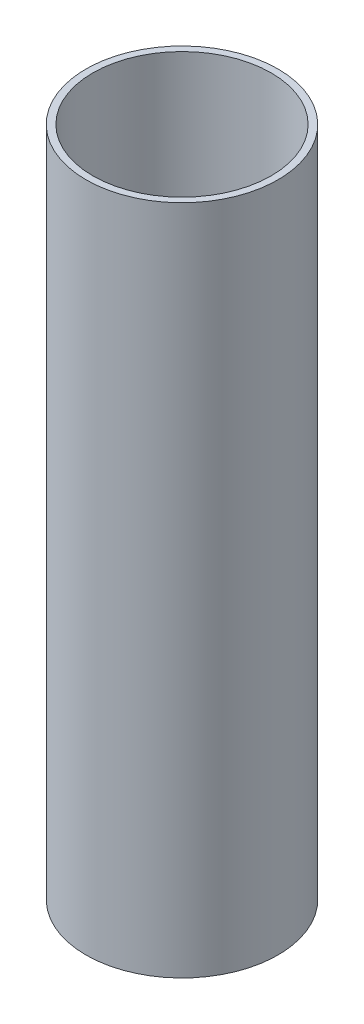
ISO-10303-21;
HEADER;
FILE_DESCRIPTION(('STEP AP214'),'2;1');
FILE_NAME('part.step','',(''),(''),'','','');
FILE_SCHEMA(('AUTOMOTIVE_DESIGN { 1 0 10303 214 1 1 1 1 }'));
ENDSEC;
DATA;
#1=APPLICATION_CONTEXT('core data for automotive mechanical design processes');
#2=APPLICATION_PROTOCOL_DEFINITION('international standard','automotive_design',2000,#1);
#3=PRODUCT_CONTEXT('',#1,'mechanical');
#4=PRODUCT('Part','Part','',(#3));
#5=PRODUCT_RELATED_PRODUCT_CATEGORY('part','',(#4));
#6=PRODUCT_DEFINITION_FORMATION('','',#4);
#7=PRODUCT_DEFINITION_CONTEXT('part definition',#1,'design');
#8=PRODUCT_DEFINITION('design','',#6,#7);
#9=PRODUCT_DEFINITION_SHAPE('','',#8);
#10=(LENGTH_UNIT() NAMED_UNIT(*) SI_UNIT(.MILLI.,.METRE.));
#11=(NAMED_UNIT(*) PLANE_ANGLE_UNIT() SI_UNIT($,.RADIAN.));
#12=(NAMED_UNIT(*) SI_UNIT($,.STERADIAN.) SOLID_ANGLE_UNIT());
#13=UNCERTAINTY_MEASURE_WITH_UNIT(LENGTH_MEASURE(1.E-05),#10,'distance_accuracy_value','');
#14=(GEOMETRIC_REPRESENTATION_CONTEXT(3) GLOBAL_UNCERTAINTY_ASSIGNED_CONTEXT((#13)) GLOBAL_UNIT_ASSIGNED_CONTEXT((#10,
#11,#12)) REPRESENTATION_CONTEXT('',''));
#15=CARTESIAN_POINT('',(0.,0.,0.));
#16=DIRECTION('',(0.,0.,1.));
#17=DIRECTION('',(1.,0.,0.));
#18=AXIS2_PLACEMENT_3D('',#15,#16,#17);
#19=CARTESIAN_POINT('',(0.,-13.97,0.));
#20=DIRECTION('',(0.,-1.,0.));
#21=DIRECTION('',(0.,0.,-1.));
#22=AXIS2_PLACEMENT_3D('',#19,#20,#21);
#23=CYLINDRICAL_SURFACE('',#22,23.622);
#24=CARTESIAN_POINT('',(0.,0.,0.));
#25=DIRECTION('',(0.,-1.,0.));
#26=DIRECTION('',(0.,0.,-1.));
#27=AXIS2_PLACEMENT_3D('',#24,#25,#26);
#28=CIRCLE('',#27,23.622);
#29=CARTESIAN_POINT('',(0.,0.,-23.622));
#30=VERTEX_POINT('',#29);
#31=EDGE_CURVE('E49',#30,#30,#28,.T.);
#32=ORIENTED_EDGE('',*,*,#31,.T.);
#33=EDGE_LOOP('',(#32));
#34=FACE_BOUND('',#33,.T.);
#35=CARTESIAN_POINT('',(0.,177.8,0.));
#36=DIRECTION('',(0.,-1.,0.));
#37=DIRECTION('',(0.,0.,-1.));
#38=AXIS2_PLACEMENT_3D('',#35,#36,#37);
#39=CIRCLE('',#38,23.622);
#40=CARTESIAN_POINT('',(0.,177.8,-23.622));
#41=VERTEX_POINT('',#40);
#42=EDGE_CURVE('E10',#41,#41,#39,.T.);
#43=ORIENTED_EDGE('',*,*,#42,.F.);
#44=EDGE_LOOP('',(#43));
#45=FACE_BOUND('',#44,.T.);
#46=ADVANCED_FACE('F35',(#34,#45),#23,.F.);
#47=CARTESIAN_POINT('',(23.622,177.8,0.));
#48=DIRECTION('',(0.,1.,0.));
#49=DIRECTION('',(0.,0.,1.));
#50=AXIS2_PLACEMENT_3D('',#47,#48,#49);
#51=PLANE('',#50);
#52=ORIENTED_EDGE('',*,*,#42,.T.);
#53=EDGE_LOOP('',(#52));
#54=FACE_BOUND('',#53,.T.);
#55=CARTESIAN_POINT('',(0.,177.8,0.));
#56=DIRECTION('',(0.,-1.,0.));
#57=DIRECTION('',(0.,0.,-1.));
#58=AXIS2_PLACEMENT_3D('',#55,#56,#57);
#59=CIRCLE('',#58,25.4254);
#60=CARTESIAN_POINT('',(0.,177.8,-25.4254));
#61=VERTEX_POINT('',#60);
#62=EDGE_CURVE('E41',#61,#61,#59,.T.);
#63=ORIENTED_EDGE('',*,*,#62,.F.);
#64=EDGE_LOOP('',(#63));
#65=FACE_BOUND('',#64,.T.);
#66=ADVANCED_FACE('F65',(#54,#65),#51,.T.);
#67=CARTESIAN_POINT('',(0.,-13.97,0.));
#68=DIRECTION('',(0.,-1.,0.));
#69=DIRECTION('',(0.,0.,-1.));
#70=AXIS2_PLACEMENT_3D('',#67,#68,#69);
#71=CYLINDRICAL_SURFACE('',#70,25.4254);
#72=ORIENTED_EDGE('',*,*,#62,.T.);
#73=EDGE_LOOP('',(#72));
#74=FACE_BOUND('',#73,.T.);
#75=CARTESIAN_POINT('',(0.,0.,0.));
#76=DIRECTION('',(0.,-1.,0.));
#77=DIRECTION('',(0.,0.,-1.));
#78=AXIS2_PLACEMENT_3D('',#75,#76,#77);
#79=CIRCLE('',#78,25.4254);
#80=CARTESIAN_POINT('',(0.,0.,-25.4254));
#81=VERTEX_POINT('',#80);
#82=EDGE_CURVE('E45',#81,#81,#79,.T.);
#83=ORIENTED_EDGE('',*,*,#82,.F.);
#84=EDGE_LOOP('',(#83));
#85=FACE_BOUND('',#84,.T.);
#86=ADVANCED_FACE('F59',(#74,#85),#71,.T.);
#87=CARTESIAN_POINT('',(23.622,0.,0.));
#88=DIRECTION('',(0.,-1.,0.));
#89=DIRECTION('',(0.,0.,-1.));
#90=AXIS2_PLACEMENT_3D('',#87,#88,#89);
#91=PLANE('',#90);
#92=ORIENTED_EDGE('',*,*,#82,.T.);
#93=EDGE_LOOP('',(#92));
#94=FACE_BOUND('',#93,.T.);
#95=ORIENTED_EDGE('',*,*,#31,.F.);
#96=EDGE_LOOP('',(#95));
#97=FACE_BOUND('',#96,.T.);
#98=ADVANCED_FACE('F57',(#94,#97),#91,.T.);
#99=CLOSED_SHELL('',(#46,#66,#86,#98));
#100=MANIFOLD_SOLID_BREP('B2',#99);
#101=ADVANCED_BREP_SHAPE_REPRESENTATION('',(#18,#100),#14);
#102=SHAPE_DEFINITION_REPRESENTATION(#9,#101);
ENDSEC;
END-ISO-10303-21;
